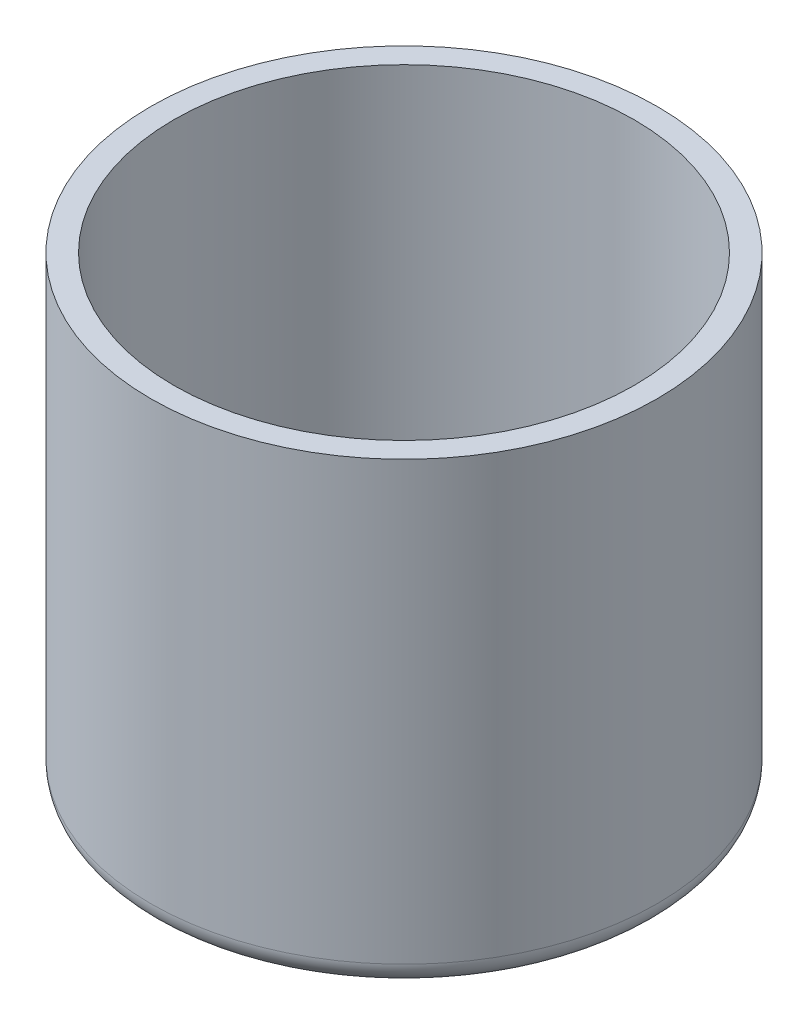
ISO-10303-21;
HEADER;
FILE_DESCRIPTION(('STEP AP214'),'2;1');
FILE_NAME('part.step','',(''),(''),'','','');
FILE_SCHEMA(('AUTOMOTIVE_DESIGN { 1 0 10303 214 1 1 1 1 }'));
ENDSEC;
DATA;
#1=APPLICATION_CONTEXT('core data for automotive mechanical design processes');
#2=APPLICATION_PROTOCOL_DEFINITION('international standard','automotive_design',2000,#1);
#3=PRODUCT_CONTEXT('',#1,'mechanical');
#4=PRODUCT('Part','Part','',(#3));
#5=PRODUCT_RELATED_PRODUCT_CATEGORY('part','',(#4));
#6=PRODUCT_DEFINITION_FORMATION('','',#4);
#7=PRODUCT_DEFINITION_CONTEXT('part definition',#1,'design');
#8=PRODUCT_DEFINITION('design','',#6,#7);
#9=PRODUCT_DEFINITION_SHAPE('','',#8);
#10=(LENGTH_UNIT() NAMED_UNIT(*) SI_UNIT(.MILLI.,.METRE.));
#11=(NAMED_UNIT(*) PLANE_ANGLE_UNIT() SI_UNIT($,.RADIAN.));
#12=(NAMED_UNIT(*) SI_UNIT($,.STERADIAN.) SOLID_ANGLE_UNIT());
#13=UNCERTAINTY_MEASURE_WITH_UNIT(LENGTH_MEASURE(1.E-05),#10,'distance_accuracy_value','');
#14=(GEOMETRIC_REPRESENTATION_CONTEXT(3) GLOBAL_UNCERTAINTY_ASSIGNED_CONTEXT((#13)) GLOBAL_UNIT_ASSIGNED_CONTEXT((#10,
#11,#12)) REPRESENTATION_CONTEXT('',''));
#15=CARTESIAN_POINT('',(0.,0.,0.));
#16=DIRECTION('',(0.,0.,1.));
#17=DIRECTION('',(1.,0.,0.));
#18=AXIS2_PLACEMENT_3D('',#15,#16,#17);
#19=CARTESIAN_POINT('',(0.,20.,0.));
#20=DIRECTION('',(0.,-1.,0.));
#21=DIRECTION('',(0.,0.,-1.));
#22=AXIS2_PLACEMENT_3D('',#19,#20,#21);
#23=CYLINDRICAL_SURFACE('',#22,11.);
#24=CARTESIAN_POINT('',(0.,1.,0.));
#25=DIRECTION('',(0.,1.,0.));
#26=DIRECTION('',(0.,0.,1.));
#27=AXIS2_PLACEMENT_3D('',#24,#25,#26);
#28=CIRCLE('',#27,11.);
#29=CARTESIAN_POINT('',(0.,1.,11.));
#30=VERTEX_POINT('',#29);
#31=EDGE_CURVE('E44',#30,#30,#28,.T.);
#32=ORIENTED_EDGE('',*,*,#31,.T.);
#33=EDGE_LOOP('',(#32));
#34=FACE_BOUND('',#33,.T.);
#35=CARTESIAN_POINT('',(0.,20.,0.));
#36=DIRECTION('',(0.,1.,0.));
#37=DIRECTION('',(0.,0.,1.));
#38=AXIS2_PLACEMENT_3D('',#35,#36,#37);
#39=CIRCLE('',#38,11.);
#40=CARTESIAN_POINT('',(0.,20.,11.));
#41=VERTEX_POINT('',#40);
#42=EDGE_CURVE('E48',#41,#41,#39,.T.);
#43=ORIENTED_EDGE('',*,*,#42,.F.);
#44=EDGE_LOOP('',(#43));
#45=FACE_BOUND('',#44,.T.);
#46=ADVANCED_FACE('F37',(#34,#45),#23,.T.);
#47=CARTESIAN_POINT('',(0.,20.,0.));
#48=DIRECTION('',(0.,1.,0.));
#49=DIRECTION('',(0.,0.,1.));
#50=AXIS2_PLACEMENT_3D('',#47,#48,#49);
#51=PLANE('',#50);
#52=CARTESIAN_POINT('',(0.,20.,0.));
#53=DIRECTION('',(0.,1.,0.));
#54=DIRECTION('',(0.,0.,1.));
#55=AXIS2_PLACEMENT_3D('',#52,#53,#54);
#56=CIRCLE('',#55,10.);
#57=CARTESIAN_POINT('',(0.,20.,10.));
#58=VERTEX_POINT('',#57);
#59=EDGE_CURVE('E55',#58,#58,#56,.T.);
#60=ORIENTED_EDGE('',*,*,#59,.F.);
#61=EDGE_LOOP('',(#60));
#62=FACE_BOUND('',#61,.T.);
#63=ORIENTED_EDGE('',*,*,#42,.T.);
#64=EDGE_LOOP('',(#63));
#65=FACE_BOUND('',#64,.T.);
#66=ADVANCED_FACE('F72',(#62,#65),#51,.T.);
#67=CARTESIAN_POINT('',(0.,0.,0.));
#68=DIRECTION('',(0.,1.,0.));
#69=DIRECTION('',(0.,0.,1.));
#70=AXIS2_PLACEMENT_3D('',#67,#68,#69);
#71=PLANE('',#70);
#72=CARTESIAN_POINT('',(0.,0.,0.));
#73=DIRECTION('',(0.,-1.,0.));
#74=DIRECTION('',(0.,0.,-1.));
#75=AXIS2_PLACEMENT_3D('',#72,#73,#74);
#76=CIRCLE('',#75,4.);
#77=CARTESIAN_POINT('',(0.,0.,-4.));
#78=VERTEX_POINT('',#77);
#79=EDGE_CURVE('E58',#78,#78,#76,.T.);
#80=ORIENTED_EDGE('',*,*,#79,.F.);
#81=EDGE_LOOP('',(#80));
#82=FACE_BOUND('',#81,.T.);
#83=CARTESIAN_POINT('',(0.,0.,0.));
#84=DIRECTION('',(0.,1.,0.));
#85=DIRECTION('',(0.,0.,1.));
#86=AXIS2_PLACEMENT_3D('',#83,#84,#85);
#87=CIRCLE('',#86,10.);
#88=CARTESIAN_POINT('',(0.,0.,10.));
#89=VERTEX_POINT('',#88);
#90=EDGE_CURVE('E10',#89,#89,#87,.F.);
#91=ORIENTED_EDGE('',*,*,#90,.T.);
#92=EDGE_LOOP('',(#91));
#93=FACE_BOUND('',#92,.T.);
#94=ADVANCED_FACE('F69',(#82,#93),#71,.F.);
#95=CARTESIAN_POINT('',(0.,2.,0.));
#96=DIRECTION('',(0.,1.,0.));
#97=DIRECTION('',(0.,0.,1.));
#98=AXIS2_PLACEMENT_3D('',#95,#96,#97);
#99=CYLINDRICAL_SURFACE('',#98,10.);
#100=CARTESIAN_POINT('',(0.,2.,0.));
#101=DIRECTION('',(0.,1.,0.));
#102=DIRECTION('',(0.,0.,1.));
#103=AXIS2_PLACEMENT_3D('',#100,#101,#102);
#104=CIRCLE('',#103,10.);
#105=CARTESIAN_POINT('',(0.,2.,10.));
#106=VERTEX_POINT('',#105);
#107=EDGE_CURVE('E52',#106,#106,#104,.T.);
#108=ORIENTED_EDGE('',*,*,#107,.F.);
#109=EDGE_LOOP('',(#108));
#110=FACE_BOUND('',#109,.T.);
#111=ORIENTED_EDGE('',*,*,#59,.T.);
#112=EDGE_LOOP('',(#111));
#113=FACE_BOUND('',#112,.T.);
#114=ADVANCED_FACE('F71',(#110,#113),#99,.F.);
#115=CARTESIAN_POINT('',(0.,2.,0.));
#116=DIRECTION('',(0.,1.,0.));
#117=DIRECTION('',(0.,0.,1.));
#118=AXIS2_PLACEMENT_3D('',#115,#116,#117);
#119=PLANE('',#118);
#120=CARTESIAN_POINT('',(0.,2.,0.));
#121=DIRECTION('',(0.,1.,0.));
#122=DIRECTION('',(0.,0.,1.));
#123=AXIS2_PLACEMENT_3D('',#120,#121,#122);
#124=CIRCLE('',#123,4.);
#125=CARTESIAN_POINT('',(0.,2.,4.));
#126=VERTEX_POINT('',#125);
#127=EDGE_CURVE('E61',#126,#126,#124,.F.);
#128=ORIENTED_EDGE('',*,*,#127,.T.);
#129=EDGE_LOOP('',(#128));
#130=FACE_BOUND('',#129,.T.);
#131=ORIENTED_EDGE('',*,*,#107,.T.);
#132=EDGE_LOOP('',(#131));
#133=FACE_BOUND('',#132,.T.);
#134=ADVANCED_FACE('F78',(#130,#133),#119,.T.);
#135=CARTESIAN_POINT('',(0.,1.,0.));
#136=DIRECTION('',(0.,1.,0.));
#137=DIRECTION('',(0.,0.,1.));
#138=AXIS2_PLACEMENT_3D('',#135,#136,#137);
#139=TOROIDAL_SURFACE('',#138,10.,1.);
#140=ORIENTED_EDGE('',*,*,#90,.F.);
#141=EDGE_LOOP('',(#140));
#142=FACE_BOUND('',#141,.T.);
#143=ORIENTED_EDGE('',*,*,#31,.F.);
#144=EDGE_LOOP('',(#143));
#145=FACE_BOUND('',#144,.T.);
#146=ADVANCED_FACE('F39',(#142,#145),#139,.T.);
#147=CARTESIAN_POINT('',(0.,20.001,0.));
#148=DIRECTION('',(0.,-1.,0.));
#149=DIRECTION('',(0.,0.,-1.));
#150=AXIS2_PLACEMENT_3D('',#147,#148,#149);
#151=CYLINDRICAL_SURFACE('',#150,4.);
#152=ORIENTED_EDGE('',*,*,#127,.F.);
#153=EDGE_LOOP('',(#152));
#154=FACE_BOUND('',#153,.T.);
#155=ORIENTED_EDGE('',*,*,#79,.T.);
#156=EDGE_LOOP('',(#155));
#157=FACE_BOUND('',#156,.T.);
#158=ADVANCED_FACE('F67',(#154,#157),#151,.F.);
#159=CLOSED_SHELL('',(#46,#66,#94,#114,#134,#146,#158));
#160=MANIFOLD_SOLID_BREP('B2',#159);
#161=ADVANCED_BREP_SHAPE_REPRESENTATION('',(#18,#160),#14);
#162=SHAPE_DEFINITION_REPRESENTATION(#9,#161);
ENDSEC;
END-ISO-10303-21;
